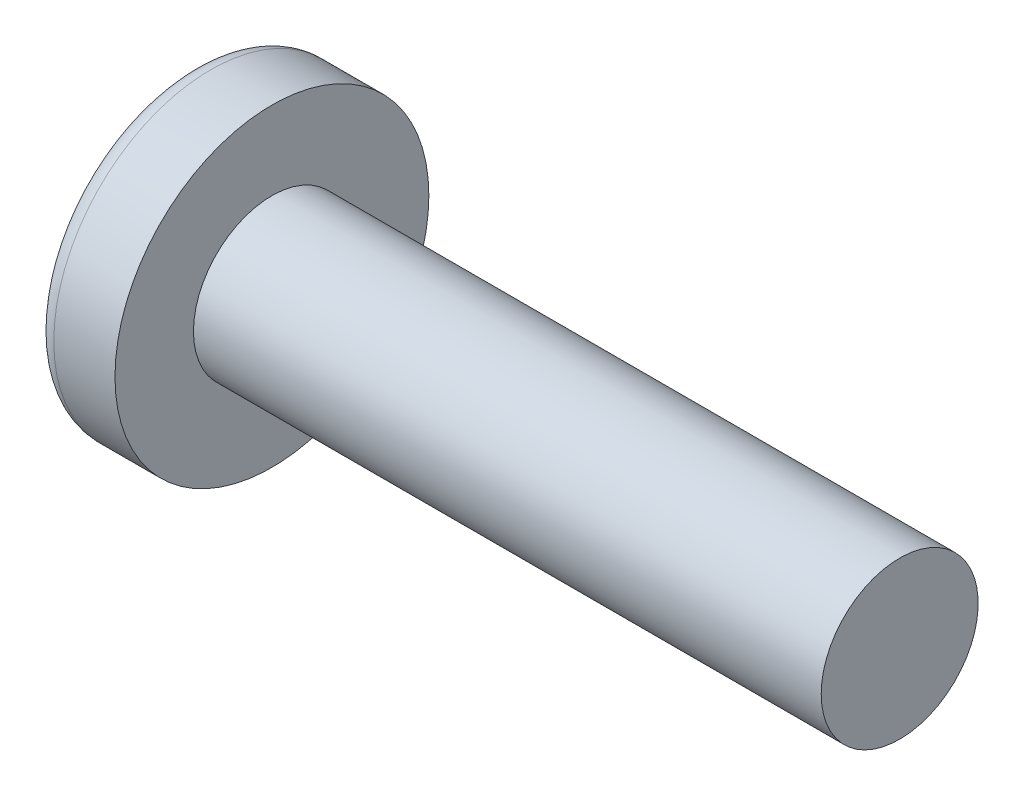
ISO-10303-21;
HEADER;
FILE_DESCRIPTION(('STEP AP214'),'2;1');
FILE_NAME('part.step','',(''),(''),'','','');
FILE_SCHEMA(('AUTOMOTIVE_DESIGN { 1 0 10303 214 1 1 1 1 }'));
ENDSEC;
DATA;
#1=APPLICATION_CONTEXT('core data for automotive mechanical design processes');
#2=APPLICATION_PROTOCOL_DEFINITION('international standard','automotive_design',2000,#1);
#3=PRODUCT_CONTEXT('',#1,'mechanical');
#4=PRODUCT('Part','Part','',(#3));
#5=PRODUCT_RELATED_PRODUCT_CATEGORY('part','',(#4));
#6=PRODUCT_DEFINITION_FORMATION('','',#4);
#7=PRODUCT_DEFINITION_CONTEXT('part definition',#1,'design');
#8=PRODUCT_DEFINITION('design','',#6,#7);
#9=PRODUCT_DEFINITION_SHAPE('','',#8);
#10=(LENGTH_UNIT() NAMED_UNIT(*) SI_UNIT(.MILLI.,.METRE.));
#11=(NAMED_UNIT(*) PLANE_ANGLE_UNIT() SI_UNIT($,.RADIAN.));
#12=(NAMED_UNIT(*) SI_UNIT($,.STERADIAN.) SOLID_ANGLE_UNIT());
#13=UNCERTAINTY_MEASURE_WITH_UNIT(LENGTH_MEASURE(1.E-05),#10,'distance_accuracy_value','');
#14=(GEOMETRIC_REPRESENTATION_CONTEXT(3) GLOBAL_UNCERTAINTY_ASSIGNED_CONTEXT((#13)) GLOBAL_UNIT_ASSIGNED_CONTEXT((#10,
#11,#12)) REPRESENTATION_CONTEXT('',''));
#15=CARTESIAN_POINT('',(0.,0.,0.));
#16=DIRECTION('',(0.,0.,1.));
#17=DIRECTION('',(1.,0.,0.));
#18=AXIS2_PLACEMENT_3D('',#15,#16,#17);
#19=CARTESIAN_POINT('',(0.,0.63,-0.5));
#20=DIRECTION('',(-0.594581022319297,-0.804035700636321,0.));
#21=DIRECTION('',(0.804035700636321,-0.594581022319297,0.));
#22=AXIS2_PLACEMENT_3D('',#19,#20,#21);
#23=PLANE('',#22);
#24=DIRECTION('',(0.,0.,1.));
#25=VECTOR('',#24,1.);
#26=CARTESIAN_POINT('',(0.672608695652169,0.132608695652178,-0.500000000000011));
#27=LINE('',#26,#25);
#28=CARTESIAN_POINT('',(0.672608695652171,0.132608695652177,-0.358695652173914));
#29=VERTEX_POINT('',#28);
#30=CARTESIAN_POINT('',(0.672608695652173,0.132608695652175,-0.132608695652174));
#31=VERTEX_POINT('',#30);
#32=EDGE_CURVE('E297',#29,#31,#27,.T.);
#33=ORIENTED_EDGE('',*,*,#32,.F.);
#34=DIRECTION('',(0.792804972746364,-0.586275946232605,0.166555666543354));
#35=VECTOR('',#34,1.);
#36=CARTESIAN_POINT('',(0.,0.63,-0.5));
#37=LINE('',#36,#35);
#38=CARTESIAN_POINT('',(0.0873856281004798,0.5653786951862,-0.481641674768807));
#39=VERTEX_POINT('',#38);
#40=EDGE_CURVE('E267',#39,#29,#37,.T.);
#41=ORIENTED_EDGE('',*,*,#40,.F.);
#42=CARTESIAN_POINT('',(2.36989545765807,-1.1225277333942,0.));
#43=DIRECTION('',(-0.594581022319297,-0.804035700636321,0.));
#44=DIRECTION('',(0.804035700636321,-0.594581022319297,0.));
#45=AXIS2_PLACEMENT_3D('',#42,#43,#44);
#46=CIRCLE('',#45,2.8793849927622);
#47=CARTESIAN_POINT('',(0.0547751327762322,0.589494019459594,-0.0075720286978301));
#48=VERTEX_POINT('',#47);
#49=EDGE_CURVE('E207',#48,#39,#46,.T.);
#50=ORIENTED_EDGE('',*,*,#49,.F.);
#51=DIRECTION('',(0.790981462786602,-0.584927468279168,0.179466382312927));
#52=VECTOR('',#51,1.);
#53=CARTESIAN_POINT('',(0.,0.63,-0.0200000000000003));
#54=LINE('',#53,#52);
#55=CARTESIAN_POINT('',(0.672608695652174,0.132608695652174,0.132608695652174));
#56=VERTEX_POINT('',#55);
#57=EDGE_CURVE('E176',#48,#56,#54,.T.);
#58=ORIENTED_EDGE('',*,*,#57,.T.);
#59=DIRECTION('',(0.691101660351893,-0.511066774041737,-0.511066774041738));
#60=VECTOR('',#59,1.);
#61=CARTESIAN_POINT('',(0.399114978582753,0.334856150291746,0.334856150291747));
#62=LINE('',#61,#60);
#63=CARTESIAN_POINT('',(0.851931818181818,0.,0.));
#64=VERTEX_POINT('',#63);
#65=EDGE_CURVE('E232',#56,#64,#62,.T.);
#66=ORIENTED_EDGE('',*,*,#65,.T.);
#67=DIRECTION('',(-0.691101660351896,0.511066774041738,-0.511066774041733));
#68=VECTOR('',#67,1.);
#69=CARTESIAN_POINT('',(0.0459158824918185,0.596045397821176,-0.59604539782117));
#70=LINE('',#69,#68);
#71=EDGE_CURVE('E240',#64,#31,#70,.T.);
#72=ORIENTED_EDGE('',*,*,#71,.T.);
#73=EDGE_LOOP('',(#33,#41,#50,#58,#66,#72));
#74=FACE_BOUND('',#73,.T.);
#75=ADVANCED_FACE('F35',(#74),#23,.F.);
#76=CARTESIAN_POINT('',(1.19,0.249999999999999,-0.25));
#77=DIRECTION('',(-0.205595998489482,0.,0.978636952809934));
#78=DIRECTION('',(0.978636952809934,0.,0.205595998489482));
#79=AXIS2_PLACEMENT_3D('',#76,#77,#78);
#80=PLANE('',#79);
#81=ORIENTED_EDGE('',*,*,#40,.T.);
#82=DIRECTION('',(0.955368837936512,0.216764358187274,0.200707739062293));
#83=VECTOR('',#82,1.);
#84=CARTESIAN_POINT('',(1.19,0.250000000000002,-0.25));
#85=LINE('',#84,#83);
#86=CARTESIAN_POINT('',(1.19,0.250000000000003,-0.249999999999997));
#87=VERTEX_POINT('',#86);
#88=EDGE_CURVE('E299',#29,#87,#85,.T.);
#89=ORIENTED_EDGE('',*,*,#88,.T.);
#90=DIRECTION('',(0.473409021532217,-0.875209955773847,0.0994556767924825));
#91=VECTOR('',#90,1.);
#92=CARTESIAN_POINT('',(0.,2.45,-0.5));
#93=LINE('',#92,#91);
#94=CARTESIAN_POINT('',(0.459045311054197,1.60134480309308,-0.403561909442396));
#95=VERTEX_POINT('',#94);
#96=EDGE_CURVE('E195',#95,#87,#93,.T.);
#97=ORIENTED_EDGE('',*,*,#96,.F.);
#98=CARTESIAN_POINT('',(3.16533883403219,0.,0.164987150006763));
#99=DIRECTION('',(-0.205595998489482,0.,0.978636952809934));
#100=DIRECTION('',(0.978636952809934,0.,0.205595998489482));
#101=AXIS2_PLACEMENT_3D('',#98,#99,#100);
#102=CIRCLE('',#101,3.19555595224155);
#103=EDGE_CURVE('E212',#95,#39,#102,.T.);
#104=ORIENTED_EDGE('',*,*,#103,.T.);
#105=EDGE_LOOP('',(#81,#89,#97,#104));
#106=FACE_BOUND('',#105,.T.);
#107=ADVANCED_FACE('F322',(#106),#80,.T.);
#108=CARTESIAN_POINT('',(1.19,0.250000000000002,-0.249999999999998));
#109=DIRECTION('',(0.221266881633904,0.,0.975213293127205));
#110=DIRECTION('',(-0.975213293127205,0.,0.221266881633904));
#111=AXIS2_PLACEMENT_3D('',#108,#109,#110);
#112=PLANE('',#111);
#113=DIRECTION('',(0.473019901759846,0.874490574682069,-0.10732384325643));
#114=VECTOR('',#113,1.);
#115=CARTESIAN_POINT('',(0.,-2.45,0.0199999999999829));
#116=LINE('',#115,#114);
#117=CARTESIAN_POINT('',(0.445410972162868,-1.62655114390058,-0.0810596323394858));
#118=VERTEX_POINT('',#117);
#119=CARTESIAN_POINT('',(1.19,-0.249999999999997,-0.250000000000002));
#120=VERTEX_POINT('',#119);
#121=EDGE_CURVE('E158',#118,#120,#116,.T.);
#122=ORIENTED_EDGE('',*,*,#121,.T.);
#123=DIRECTION('',(-0.955368837936512,-0.200707739062295,0.216764358187275));
#124=VECTOR('',#123,1.);
#125=CARTESIAN_POINT('',(1.2858749597164,-0.229858201740249,-0.27175314212053));
#126=LINE('',#125,#124);
#127=CARTESIAN_POINT('',(0.672608695652176,-0.358695652173911,-0.132608695652177));
#128=VERTEX_POINT('',#127);
#129=EDGE_CURVE('E11',#120,#128,#126,.T.);
#130=ORIENTED_EDGE('',*,*,#129,.T.);
#131=DIRECTION('',(0.,-1.,0.));
#132=VECTOR('',#131,1.);
#133=CARTESIAN_POINT('',(0.672608695652173,0.249999999999999,-0.132608695652172));
#134=LINE('',#133,#132);
#135=CARTESIAN_POINT('',(0.672608695652175,-0.132608695652172,-0.132608695652175));
#136=VERTEX_POINT('',#135);
#137=EDGE_CURVE('E154',#136,#128,#134,.T.);
#138=ORIENTED_EDGE('',*,*,#137,.F.);
#139=DIRECTION('',(0.790981462786602,0.58492746827917,-0.179466382312923));
#140=VECTOR('',#139,1.);
#141=CARTESIAN_POINT('',(0.,-0.63,0.0199999999999959));
#142=LINE('',#141,#140);
#143=CARTESIAN_POINT('',(0.0547751327762314,-0.589494019459594,0.00757202869782609));
#144=VERTEX_POINT('',#143);
#145=EDGE_CURVE('E227',#144,#136,#142,.T.);
#146=ORIENTED_EDGE('',*,*,#145,.F.);
#147=CARTESIAN_POINT('',(3.04764674278039,0.,-0.671482874412358));
#148=DIRECTION('',(0.221266881633904,0.,0.975213293127205));
#149=DIRECTION('',(0.975213293127205,0.,-0.221266881633904));
#150=AXIS2_PLACEMENT_3D('',#147,#148,#149);
#151=CIRCLE('',#150,3.12504387719365);
#152=EDGE_CURVE('E163',#144,#118,#151,.T.);
#153=ORIENTED_EDGE('',*,*,#152,.T.);
#154=EDGE_LOOP('',(#122,#130,#138,#146,#153));
#155=FACE_BOUND('',#154,.T.);
#156=ADVANCED_FACE('F160',(#155),#112,.T.);
#157=CARTESIAN_POINT('',(1.19,-0.249999999999999,-0.250000000000001));
#158=DIRECTION('',(0.221266881633904,0.975213293127205,0.));
#159=DIRECTION('',(-0.975213293127205,0.221266881633904,0.));
#160=AXIS2_PLACEMENT_3D('',#157,#158,#159);
#161=PLANE('',#160);
#162=DIRECTION('',(0.473019901759846,-0.107323843256433,-0.874490574682068));
#163=VECTOR('',#162,1.);
#164=CARTESIAN_POINT('',(0.,0.0199999999999915,2.45));
#165=LINE('',#164,#163);
#166=CARTESIAN_POINT('',(0.445410972162869,-0.0810596323394804,1.62655114390058));
#167=VERTEX_POINT('',#166);
#168=CARTESIAN_POINT('',(1.19,-0.250000000000002,0.249999999999998));
#169=VERTEX_POINT('',#168);
#170=EDGE_CURVE('E248',#167,#169,#165,.T.);
#171=ORIENTED_EDGE('',*,*,#170,.T.);
#172=DIRECTION('',(-0.955368837936512,0.216764358187275,0.200707739062294));
#173=VECTOR('',#172,1.);
#174=CARTESIAN_POINT('',(1.2858749597164,-0.271753142120529,0.229858201740249));
#175=LINE('',#174,#173);
#176=CARTESIAN_POINT('',(0.672608695652176,-0.132608695652175,0.358695652173912));
#177=VERTEX_POINT('',#176);
#178=EDGE_CURVE('E221',#169,#177,#175,.T.);
#179=ORIENTED_EDGE('',*,*,#178,.T.);
#180=DIRECTION('',(0.,0.,1.));
#181=VECTOR('',#180,1.);
#182=CARTESIAN_POINT('',(0.672608695652173,-0.132608695652173,-0.249999999999999));
#183=LINE('',#182,#181);
#184=CARTESIAN_POINT('',(0.672608695652175,-0.132608695652174,0.132608695652173));
#185=VERTEX_POINT('',#184);
#186=EDGE_CURVE('E290',#185,#177,#183,.T.);
#187=ORIENTED_EDGE('',*,*,#186,.F.);
#188=DIRECTION('',(0.790981462786602,-0.179466382312925,-0.584927468279169));
#189=VECTOR('',#188,1.);
#190=CARTESIAN_POINT('',(0.,0.0199999999999981,0.63));
#191=LINE('',#190,#189);
#192=CARTESIAN_POINT('',(0.0547751327762322,0.00757202869782815,0.589494019459594));
#193=VERTEX_POINT('',#192);
#194=EDGE_CURVE('E235',#193,#185,#191,.T.);
#195=ORIENTED_EDGE('',*,*,#194,.F.);
#196=CARTESIAN_POINT('',(3.04764674278039,-0.671482874412358,0.));
#197=DIRECTION('',(0.221266881633904,0.975213293127205,0.));
#198=DIRECTION('',(-0.975213293127205,0.221266881633904,0.));
#199=AXIS2_PLACEMENT_3D('',#196,#197,#198);
#200=CIRCLE('',#199,3.12504387719365);
#201=EDGE_CURVE('E255',#193,#167,#200,.T.);
#202=ORIENTED_EDGE('',*,*,#201,.T.);
#203=EDGE_LOOP('',(#171,#179,#187,#195,#202));
#204=FACE_BOUND('',#203,.T.);
#205=ADVANCED_FACE('F276',(#204),#161,.T.);
#206=CARTESIAN_POINT('',(1.19,-0.25,0.25));
#207=DIRECTION('',(0.221266881633904,0.,-0.975213293127205));
#208=DIRECTION('',(-0.975213293127205,0.,-0.221266881633904));
#209=AXIS2_PLACEMENT_3D('',#206,#207,#208);
#210=PLANE('',#209);
#211=DIRECTION('',(0.473019901759846,-0.874490574682068,0.107323843256436));
#212=VECTOR('',#211,1.);
#213=CARTESIAN_POINT('',(0.,2.45,-0.0200000000000001));
#214=LINE('',#213,#212);
#215=CARTESIAN_POINT('',(0.445410972162869,1.62655114390058,0.0810596323394745));
#216=VERTEX_POINT('',#215);
#217=CARTESIAN_POINT('',(1.19,0.249999999999999,0.250000000000001));
#218=VERTEX_POINT('',#217);
#219=EDGE_CURVE('E264',#216,#218,#214,.T.);
#220=ORIENTED_EDGE('',*,*,#219,.T.);
#221=DIRECTION('',(-0.955368837936512,0.200707739062293,-0.216764358187276));
#222=VECTOR('',#221,1.);
#223=CARTESIAN_POINT('',(1.2858749597164,0.22985820174025,0.271753142120529));
#224=LINE('',#223,#222);
#225=CARTESIAN_POINT('',(0.672608695652176,0.358695652173912,0.132608695652174));
#226=VERTEX_POINT('',#225);
#227=EDGE_CURVE('E257',#218,#226,#224,.T.);
#228=ORIENTED_EDGE('',*,*,#227,.T.);
#229=DIRECTION('',(0.,1.,0.));
#230=VECTOR('',#229,1.);
#231=CARTESIAN_POINT('',(0.672608695652173,-0.249999999999998,0.132608695652174));
#232=LINE('',#231,#230);
#233=EDGE_CURVE('E242',#56,#226,#232,.T.);
#234=ORIENTED_EDGE('',*,*,#233,.F.);
#235=ORIENTED_EDGE('',*,*,#57,.F.);
#236=CARTESIAN_POINT('',(3.04764674278039,0.,0.671482874412358));
#237=DIRECTION('',(0.221266881633904,0.,-0.975213293127205));
#238=DIRECTION('',(-0.975213293127205,0.,-0.221266881633904));
#239=AXIS2_PLACEMENT_3D('',#236,#237,#238);
#240=CIRCLE('',#239,3.12504387719365);
#241=EDGE_CURVE('E210',#48,#216,#240,.T.);
#242=ORIENTED_EDGE('',*,*,#241,.T.);
#243=EDGE_LOOP('',(#220,#228,#234,#235,#242));
#244=FACE_BOUND('',#243,.T.);
#245=ADVANCED_FACE('F329',(#244),#210,.T.);
#246=CARTESIAN_POINT('',(-25.4,0.,0.));
#247=DIRECTION('',(-1.,0.,0.));
#248=DIRECTION('',(0.,0.,1.));
#249=AXIS2_PLACEMENT_3D('',#246,#247,#248);
#250=CYLINDRICAL_SURFACE('',#249,1.);
#251=CARTESIAN_POINT('',(9.6,0.,0.));
#252=DIRECTION('',(-1.,0.,0.));
#253=DIRECTION('',(0.,0.,1.));
#254=AXIS2_PLACEMENT_3D('',#251,#252,#253);
#255=CIRCLE('',#254,1.);
#256=CARTESIAN_POINT('',(9.6,0.,1.));
#257=VERTEX_POINT('',#256);
#258=EDGE_CURVE('E191',#257,#257,#255,.T.);
#259=ORIENTED_EDGE('',*,*,#258,.T.);
#260=EDGE_LOOP('',(#259));
#261=FACE_BOUND('',#260,.T.);
#262=CARTESIAN_POINT('',(1.6,0.,0.));
#263=DIRECTION('',(-1.,0.,0.));
#264=DIRECTION('',(0.,0.,1.));
#265=AXIS2_PLACEMENT_3D('',#262,#263,#264);
#266=CIRCLE('',#265,1.);
#267=CARTESIAN_POINT('',(1.6,0.,1.));
#268=VERTEX_POINT('',#267);
#269=EDGE_CURVE('E204',#268,#268,#266,.T.);
#270=ORIENTED_EDGE('',*,*,#269,.F.);
#271=EDGE_LOOP('',(#270));
#272=FACE_BOUND('',#271,.T.);
#273=ADVANCED_FACE('F37',(#261,#272),#250,.T.);
#274=CARTESIAN_POINT('',(1.6,1.,0.));
#275=DIRECTION('',(-1.,0.,0.));
#276=DIRECTION('',(0.,0.,1.));
#277=AXIS2_PLACEMENT_3D('',#274,#275,#276);
#278=PLANE('',#277);
#279=CARTESIAN_POINT('',(1.6,0.,0.));
#280=DIRECTION('',(-1.,0.,0.));
#281=DIRECTION('',(0.,0.,1.));
#282=AXIS2_PLACEMENT_3D('',#279,#280,#281);
#283=CIRCLE('',#282,2.);
#284=CARTESIAN_POINT('',(1.6,0.,2.));
#285=VERTEX_POINT('',#284);
#286=EDGE_CURVE('E201',#285,#285,#283,.T.);
#287=ORIENTED_EDGE('',*,*,#286,.F.);
#288=EDGE_LOOP('',(#287));
#289=FACE_BOUND('',#288,.T.);
#290=ORIENTED_EDGE('',*,*,#269,.T.);
#291=EDGE_LOOP('',(#290));
#292=FACE_BOUND('',#291,.T.);
#293=ADVANCED_FACE('F499',(#289,#292),#278,.F.);
#294=CARTESIAN_POINT('',(-25.4,0.,0.));
#295=DIRECTION('',(-1.,0.,0.));
#296=DIRECTION('',(0.,0.,1.));
#297=AXIS2_PLACEMENT_3D('',#294,#295,#296);
#298=CYLINDRICAL_SURFACE('',#297,2.);
#299=ORIENTED_EDGE('',*,*,#286,.T.);
#300=EDGE_LOOP('',(#299));
#301=FACE_BOUND('',#300,.T.);
#302=CARTESIAN_POINT('',(0.820084035097039,0.,0.));
#303=DIRECTION('',(-1.,0.,0.));
#304=DIRECTION('',(0.,0.,1.));
#305=AXIS2_PLACEMENT_3D('',#302,#303,#304);
#306=CIRCLE('',#305,2.);
#307=CARTESIAN_POINT('',(0.820084035097039,0.,2.));
#308=VERTEX_POINT('',#307);
#309=EDGE_CURVE('E198',#308,#308,#306,.T.);
#310=ORIENTED_EDGE('',*,*,#309,.F.);
#311=EDGE_LOOP('',(#310));
#312=FACE_BOUND('',#311,.T.);
#313=ADVANCED_FACE('F349',(#301,#312),#298,.T.);
#314=CARTESIAN_POINT('',(0.820084035097039,0.,0.));
#315=DIRECTION('',(-1.,0.,0.));
#316=DIRECTION('',(0.,0.,1.));
#317=AXIS2_PLACEMENT_3D('',#314,#315,#316);
#318=TOROIDAL_SURFACE('',#317,1.76,0.24);
#319=ORIENTED_EDGE('',*,*,#309,.T.);
#320=EDGE_LOOP('',(#319));
#321=FACE_BOUND('',#320,.T.);
#322=CARTESIAN_POINT('',(0.627117875780583,0.,0.));
#323=DIRECTION('',(-1.,0.,0.));
#324=DIRECTION('',(0.,0.,1.));
#325=AXIS2_PLACEMENT_3D('',#322,#323,#324);
#326=CIRCLE('',#325,1.9027027027027);
#327=CARTESIAN_POINT('',(0.627117875780583,0.,1.9027027027027));
#328=VERTEX_POINT('',#327);
#329=EDGE_CURVE('E194',#328,#328,#326,.T.);
#330=ORIENTED_EDGE('',*,*,#329,.F.);
#331=EDGE_LOOP('',(#330));
#332=FACE_BOUND('',#331,.T.);
#333=ADVANCED_FACE('F340',(#321,#332),#318,.T.);
#334=CARTESIAN_POINT('',(3.2,0.,0.));
#335=DIRECTION('',(-1.,0.,0.));
#336=DIRECTION('',(0.,1.,0.));
#337=AXIS2_PLACEMENT_3D('',#334,#335,#336);
#338=SPHERICAL_SURFACE('',#337,3.2);
#339=CARTESIAN_POINT('',(3.16533883403219,0.164987150006763,0.));
#340=DIRECTION('',(-0.205595998489482,0.978636952809934,0.));
#341=DIRECTION('',(-0.978636952809934,-0.205595998489482,0.));
#342=AXIS2_PLACEMENT_3D('',#339,#340,#341);
#343=CIRCLE('',#342,3.19555595224155);
#344=CARTESIAN_POINT('',(0.459045311054196,-0.403561909442379,-1.60134480309309));
#345=VERTEX_POINT('',#344);
#346=CARTESIAN_POINT('',(0.0873856281004798,-0.481641674768801,-0.565378695186206));
#347=VERTEX_POINT('',#346);
#348=EDGE_CURVE('E302',#345,#347,#343,.T.);
#349=ORIENTED_EDGE('',*,*,#348,.F.);
#350=CARTESIAN_POINT('',(1.74959159859977,0.,0.784539089848308));
#351=DIRECTION('',(0.879570874094627,0.,-0.475767881896639));
#352=DIRECTION('',(-0.475767881896639,0.,-0.879570874094627));
#353=AXIS2_PLACEMENT_3D('',#350,#351,#352);
#354=CIRCLE('',#353,2.74241023292424);
#355=CARTESIAN_POINT('',(0.445410972162869,0.0810596323394916,-1.62655114390058));
#356=VERTEX_POINT('',#355);
#357=EDGE_CURVE('E153',#345,#356,#354,.T.);
#358=ORIENTED_EDGE('',*,*,#357,.T.);
#359=CARTESIAN_POINT('',(3.04764674278039,0.671482874412358,0.));
#360=DIRECTION('',(0.221266881633904,-0.975213293127205,0.));
#361=DIRECTION('',(0.975213293127205,0.221266881633904,0.));
#362=AXIS2_PLACEMENT_3D('',#359,#360,#361);
#363=CIRCLE('',#362,3.12504387719364);
#364=CARTESIAN_POINT('',(0.0547751327762322,-0.00757202869782392,-0.589494019459594));
#365=VERTEX_POINT('',#364);
#366=EDGE_CURVE('E293',#365,#356,#363,.T.);
#367=ORIENTED_EDGE('',*,*,#366,.F.);
#368=CARTESIAN_POINT('',(2.36989545765807,0.,1.1225277333942));
#369=DIRECTION('',(-0.594581022319297,0.,0.804035700636321));
#370=DIRECTION('',(0.804035700636321,0.,0.594581022319297));
#371=AXIS2_PLACEMENT_3D('',#368,#369,#370);
#372=CIRCLE('',#371,2.8793849927622);
#373=EDGE_CURVE('E304',#365,#347,#372,.T.);
#374=ORIENTED_EDGE('',*,*,#373,.T.);
#375=EDGE_LOOP('',(#349,#358,#367,#374));
#376=FACE_BOUND('',#375,.T.);
#377=CARTESIAN_POINT('',(3.16533883403219,0.,-0.164987150006763));
#378=DIRECTION('',(-0.205595998489482,0.,-0.978636952809934));
#379=DIRECTION('',(-0.978636952809934,0.,0.205595998489482));
#380=AXIS2_PLACEMENT_3D('',#377,#378,#379);
#381=CIRCLE('',#380,3.19555595224155);
#382=CARTESIAN_POINT('',(0.459045311054196,-1.60134480309309,0.403561909442385));
#383=VERTEX_POINT('',#382);
#384=CARTESIAN_POINT('',(0.0873856281004789,-0.565378695186204,0.481641674768803));
#385=VERTEX_POINT('',#384);
#386=EDGE_CURVE('E284',#383,#385,#381,.T.);
#387=ORIENTED_EDGE('',*,*,#386,.F.);
#388=CARTESIAN_POINT('',(1.74959159859977,0.784539089848306,0.));
#389=DIRECTION('',(0.879570874094627,-0.475767881896639,0.));
#390=DIRECTION('',(0.475767881896639,0.879570874094627,0.));
#391=AXIS2_PLACEMENT_3D('',#388,#389,#390);
#392=CIRCLE('',#391,2.74241023292424);
#393=EDGE_CURVE('E282',#383,#118,#392,.T.);
#394=ORIENTED_EDGE('',*,*,#393,.T.);
#395=ORIENTED_EDGE('',*,*,#152,.F.);
#396=CARTESIAN_POINT('',(2.36989545765807,1.1225277333942,0.));
#397=DIRECTION('',(-0.594581022319297,0.804035700636321,0.));
#398=DIRECTION('',(-0.804035700636321,-0.594581022319297,0.));
#399=AXIS2_PLACEMENT_3D('',#396,#397,#398);
#400=CIRCLE('',#399,2.8793849927622);
#401=EDGE_CURVE('E287',#144,#385,#400,.T.);
#402=ORIENTED_EDGE('',*,*,#401,.T.);
#403=EDGE_LOOP('',(#387,#394,#395,#402));
#404=FACE_BOUND('',#403,.T.);
#405=CARTESIAN_POINT('',(3.16533883403219,-0.164987150006763,0.));
#406=DIRECTION('',(-0.205595998489482,-0.978636952809934,0.));
#407=DIRECTION('',(0.978636952809934,-0.205595998489482,0.));
#408=AXIS2_PLACEMENT_3D('',#405,#406,#407);
#409=CIRCLE('',#408,3.19555595224155);
#410=CARTESIAN_POINT('',(0.459045311054196,0.40356190944239,1.60134480309308));
#411=VERTEX_POINT('',#410);
#412=CARTESIAN_POINT('',(0.0873856281004802,0.481641674768805,0.565378695186202));
#413=VERTEX_POINT('',#412);
#414=EDGE_CURVE('E187',#411,#413,#409,.T.);
#415=ORIENTED_EDGE('',*,*,#414,.F.);
#416=CARTESIAN_POINT('',(1.74959159859977,0.,-0.784539089848308));
#417=DIRECTION('',(0.879570874094627,0.,0.475767881896639));
#418=DIRECTION('',(0.475767881896639,0.,-0.879570874094627));
#419=AXIS2_PLACEMENT_3D('',#416,#417,#418);
#420=CIRCLE('',#419,2.74241023292424);
#421=EDGE_CURVE('E183',#411,#167,#420,.T.);
#422=ORIENTED_EDGE('',*,*,#421,.T.);
#423=ORIENTED_EDGE('',*,*,#201,.F.);
#424=CARTESIAN_POINT('',(2.36989545765807,0.,-1.1225277333942));
#425=DIRECTION('',(-0.594581022319297,0.,-0.804035700636321));
#426=DIRECTION('',(-0.804035700636321,0.,0.594581022319297));
#427=AXIS2_PLACEMENT_3D('',#424,#425,#426);
#428=CIRCLE('',#427,2.8793849927622);
#429=EDGE_CURVE('E245',#193,#413,#428,.T.);
#430=ORIENTED_EDGE('',*,*,#429,.T.);
#431=EDGE_LOOP('',(#415,#422,#423,#430));
#432=FACE_BOUND('',#431,.T.);
#433=ORIENTED_EDGE('',*,*,#103,.F.);
#434=CARTESIAN_POINT('',(1.74959159859977,-0.784539089848309,0.));
#435=DIRECTION('',(0.879570874094627,0.475767881896639,0.));
#436=DIRECTION('',(-0.475767881896639,0.879570874094627,0.));
#437=AXIS2_PLACEMENT_3D('',#434,#435,#436);
#438=CIRCLE('',#437,2.74241023292424);
#439=EDGE_CURVE('E215',#95,#216,#438,.T.);
#440=ORIENTED_EDGE('',*,*,#439,.T.);
#441=ORIENTED_EDGE('',*,*,#241,.F.);
#442=ORIENTED_EDGE('',*,*,#49,.T.);
#443=EDGE_LOOP('',(#433,#440,#441,#442));
#444=FACE_BOUND('',#443,.T.);
#445=ORIENTED_EDGE('',*,*,#329,.T.);
#446=EDGE_LOOP('',(#445));
#447=FACE_BOUND('',#446,.T.);
#448=ADVANCED_FACE('F318',(#376,#404,#432,#444,#447),#338,.T.);
#449=CARTESIAN_POINT('',(9.6,1.,0.));
#450=DIRECTION('',(1.,0.,0.));
#451=DIRECTION('',(0.,0.,-1.));
#452=AXIS2_PLACEMENT_3D('',#449,#450,#451);
#453=PLANE('',#452);
#454=ORIENTED_EDGE('',*,*,#258,.F.);
#455=EDGE_LOOP('',(#454));
#456=FACE_BOUND('',#455,.T.);
#457=ADVANCED_FACE('F339',(#456),#453,.T.);
#458=CARTESIAN_POINT('',(1.19,0.25,0.25));
#459=DIRECTION('',(0.879570874094627,0.475767881896639,0.));
#460=DIRECTION('',(-0.475767881896639,0.879570874094627,0.));
#461=AXIS2_PLACEMENT_3D('',#458,#459,#460);
#462=PLANE('',#461);
#463=ORIENTED_EDGE('',*,*,#96,.T.);
#464=DIRECTION('',(0.,0.,-1.));
#465=VECTOR('',#464,1.);
#466=CARTESIAN_POINT('',(1.19,0.25,0.25));
#467=LINE('',#466,#465);
#468=EDGE_CURVE('E182',#218,#87,#467,.T.);
#469=ORIENTED_EDGE('',*,*,#468,.F.);
#470=ORIENTED_EDGE('',*,*,#219,.F.);
#471=ORIENTED_EDGE('',*,*,#439,.F.);
#472=EDGE_LOOP('',(#463,#469,#470,#471));
#473=FACE_BOUND('',#472,.T.);
#474=ADVANCED_FACE('F346',(#473),#462,.F.);
#475=CARTESIAN_POINT('',(1.19,0.25,-0.25));
#476=DIRECTION('',(-1.,0.,0.));
#477=DIRECTION('',(0.,0.,1.));
#478=AXIS2_PLACEMENT_3D('',#475,#476,#477);
#479=PLANE('',#478);
#480=DIRECTION('',(0.,1.,0.));
#481=VECTOR('',#480,1.);
#482=CARTESIAN_POINT('',(1.19,-0.25,-0.25));
#483=LINE('',#482,#481);
#484=EDGE_CURVE('E150',#120,#87,#483,.T.);
#485=ORIENTED_EDGE('',*,*,#484,.F.);
#486=DIRECTION('',(0.,0.,1.));
#487=VECTOR('',#486,1.);
#488=CARTESIAN_POINT('',(1.19,-0.25,-0.25));
#489=LINE('',#488,#487);
#490=EDGE_CURVE('E170',#120,#169,#489,.T.);
#491=ORIENTED_EDGE('',*,*,#490,.T.);
#492=DIRECTION('',(0.,-1.,0.));
#493=VECTOR('',#492,1.);
#494=CARTESIAN_POINT('',(1.19,0.25,0.25));
#495=LINE('',#494,#493);
#496=EDGE_CURVE('E177',#218,#169,#495,.T.);
#497=ORIENTED_EDGE('',*,*,#496,.F.);
#498=ORIENTED_EDGE('',*,*,#468,.T.);
#499=EDGE_LOOP('',(#485,#491,#497,#498));
#500=FACE_BOUND('',#499,.T.);
#501=ADVANCED_FACE('F180',(#500),#479,.T.);
#502=CARTESIAN_POINT('',(1.19,-0.250000000000001,0.249999999999999));
#503=DIRECTION('',(0.879570874094627,0.,0.475767881896639));
#504=DIRECTION('',(-0.475767881896639,0.,0.879570874094627));
#505=AXIS2_PLACEMENT_3D('',#502,#503,#504);
#506=PLANE('',#505);
#507=DIRECTION('',(0.473409021532217,-0.0994556767924795,-0.875209955773847));
#508=VECTOR('',#507,1.);
#509=CARTESIAN_POINT('',(0.,0.499999999999991,2.45));
#510=LINE('',#509,#508);
#511=EDGE_CURVE('E243',#411,#218,#510,.T.);
#512=ORIENTED_EDGE('',*,*,#511,.T.);
#513=ORIENTED_EDGE('',*,*,#496,.T.);
#514=ORIENTED_EDGE('',*,*,#170,.F.);
#515=ORIENTED_EDGE('',*,*,#421,.F.);
#516=EDGE_LOOP('',(#512,#513,#514,#515));
#517=FACE_BOUND('',#516,.T.);
#518=ADVANCED_FACE('F273',(#517),#506,.F.);
#519=CARTESIAN_POINT('',(1.19,0.249999999999999,0.25));
#520=DIRECTION('',(-0.205595998489482,-0.978636952809934,0.));
#521=DIRECTION('',(0.978636952809934,-0.205595998489482,0.));
#522=AXIS2_PLACEMENT_3D('',#519,#520,#521);
#523=PLANE('',#522);
#524=ORIENTED_EDGE('',*,*,#414,.T.);
#525=DIRECTION('',(0.792804972746364,-0.166555666543352,-0.586275946232606));
#526=VECTOR('',#525,1.);
#527=CARTESIAN_POINT('',(0.,0.499999999999998,0.630000000000002));
#528=LINE('',#527,#526);
#529=EDGE_CURVE('E278',#413,#226,#528,.T.);
#530=ORIENTED_EDGE('',*,*,#529,.T.);
#531=ORIENTED_EDGE('',*,*,#227,.F.);
#532=ORIENTED_EDGE('',*,*,#511,.F.);
#533=EDGE_LOOP('',(#524,#530,#531,#532));
#534=FACE_BOUND('',#533,.T.);
#535=ADVANCED_FACE('F332',(#534),#523,.T.);
#536=CARTESIAN_POINT('',(0.,0.499999999999998,0.630000000000002));
#537=DIRECTION('',(-0.594581022319297,0.,-0.804035700636321));
#538=DIRECTION('',(0.804035700636321,0.,-0.594581022319297));
#539=AXIS2_PLACEMENT_3D('',#536,#537,#538);
#540=PLANE('',#539);
#541=ORIENTED_EDGE('',*,*,#194,.T.);
#542=DIRECTION('',(0.691101660351893,0.51106677404174,-0.511066774041735));
#543=VECTOR('',#542,1.);
#544=CARTESIAN_POINT('',(0.399114978582753,-0.334856150291748,0.334856150291745));
#545=LINE('',#544,#543);
#546=EDGE_CURVE('E218',#185,#64,#545,.T.);
#547=ORIENTED_EDGE('',*,*,#546,.T.);
#548=ORIENTED_EDGE('',*,*,#65,.F.);
#549=ORIENTED_EDGE('',*,*,#233,.T.);
#550=ORIENTED_EDGE('',*,*,#529,.F.);
#551=ORIENTED_EDGE('',*,*,#429,.F.);
#552=EDGE_LOOP('',(#541,#547,#548,#549,#550,#551));
#553=FACE_BOUND('',#552,.T.);
#554=ADVANCED_FACE('F231',(#553),#540,.F.);
#555=CARTESIAN_POINT('',(1.19,-0.249999999999998,-0.250000000000002));
#556=DIRECTION('',(0.879570874094627,-0.475767881896639,0.));
#557=DIRECTION('',(-0.475767881896639,-0.879570874094627,0.));
#558=AXIS2_PLACEMENT_3D('',#555,#556,#557);
#559=PLANE('',#558);
#560=DIRECTION('',(0.473409021532217,0.875209955773847,-0.0994556767924764));
#561=VECTOR('',#560,1.);
#562=CARTESIAN_POINT('',(0.,-2.45,0.499999999999983));
#563=LINE('',#562,#561);
#564=EDGE_CURVE('E166',#383,#169,#563,.T.);
#565=ORIENTED_EDGE('',*,*,#564,.T.);
#566=ORIENTED_EDGE('',*,*,#490,.F.);
#567=ORIENTED_EDGE('',*,*,#121,.F.);
#568=ORIENTED_EDGE('',*,*,#393,.F.);
#569=EDGE_LOOP('',(#565,#566,#567,#568));
#570=FACE_BOUND('',#569,.T.);
#571=ADVANCED_FACE('F171',(#570),#559,.F.);
#572=CARTESIAN_POINT('',(1.19,-0.250000000000001,0.249999999999998));
#573=DIRECTION('',(-0.205595998489482,0.,-0.978636952809934));
#574=DIRECTION('',(0.978636952809934,0.,-0.205595998489482));
#575=AXIS2_PLACEMENT_3D('',#572,#573,#574);
#576=PLANE('',#575);
#577=ORIENTED_EDGE('',*,*,#386,.T.);
#578=DIRECTION('',(0.792804972746364,0.586275946232606,-0.16655566654335));
#579=VECTOR('',#578,1.);
#580=CARTESIAN_POINT('',(0.,-0.630000000000004,0.499999999999996));
#581=LINE('',#580,#579);
#582=EDGE_CURVE('E58',#385,#177,#581,.T.);
#583=ORIENTED_EDGE('',*,*,#582,.T.);
#584=ORIENTED_EDGE('',*,*,#178,.F.);
#585=ORIENTED_EDGE('',*,*,#564,.F.);
#586=EDGE_LOOP('',(#577,#583,#584,#585));
#587=FACE_BOUND('',#586,.T.);
#588=ADVANCED_FACE('F336',(#587),#576,.T.);
#589=CARTESIAN_POINT('',(0.,-0.630000000000004,0.499999999999996));
#590=DIRECTION('',(-0.594581022319297,0.804035700636321,0.));
#591=DIRECTION('',(0.804035700636321,0.594581022319297,0.));
#592=AXIS2_PLACEMENT_3D('',#589,#590,#591);
#593=PLANE('',#592);
#594=ORIENTED_EDGE('',*,*,#145,.T.);
#595=DIRECTION('',(0.691101660351893,0.511066774041733,0.511066774041742));
#596=VECTOR('',#595,1.);
#597=CARTESIAN_POINT('',(0.399114978582753,-0.334856150291743,-0.334856150291749));
#598=LINE('',#597,#596);
#599=EDGE_CURVE('E43',#136,#64,#598,.T.);
#600=ORIENTED_EDGE('',*,*,#599,.T.);
#601=ORIENTED_EDGE('',*,*,#546,.F.);
#602=ORIENTED_EDGE('',*,*,#186,.T.);
#603=ORIENTED_EDGE('',*,*,#582,.F.);
#604=ORIENTED_EDGE('',*,*,#401,.F.);
#605=EDGE_LOOP('',(#594,#600,#601,#602,#603,#604));
#606=FACE_BOUND('',#605,.T.);
#607=ADVANCED_FACE('F225',(#606),#593,.F.);
#608=CARTESIAN_POINT('',(1.19,0.249999999999997,0.250000000000003));
#609=DIRECTION('',(0.221266881633904,-0.975213293127205,0.));
#610=DIRECTION('',(-0.975213293127205,-0.221266881633904,0.));
#611=AXIS2_PLACEMENT_3D('',#608,#609,#610);
#612=PLANE('',#611);
#613=ORIENTED_EDGE('',*,*,#366,.T.);
#614=DIRECTION('',(0.473019901759846,0.107323843256426,0.874490574682069));
#615=VECTOR('',#614,1.);
#616=CARTESIAN_POINT('',(0.,-0.0199999999999744,-2.45));
#617=LINE('',#616,#615);
#618=EDGE_CURVE('E155',#356,#87,#617,.T.);
#619=ORIENTED_EDGE('',*,*,#618,.T.);
#620=ORIENTED_EDGE('',*,*,#88,.F.);
#621=ORIENTED_EDGE('',*,*,#32,.T.);
#622=DIRECTION('',(0.790981462786602,0.179466382312921,0.58492746827917));
#623=VECTOR('',#622,1.);
#624=CARTESIAN_POINT('',(0.,-0.0199999999999937,-0.630000000000001));
#625=LINE('',#624,#623);
#626=EDGE_CURVE('E309',#365,#31,#625,.T.);
#627=ORIENTED_EDGE('',*,*,#626,.F.);
#628=EDGE_LOOP('',(#613,#619,#620,#621,#627));
#629=FACE_BOUND('',#628,.T.);
#630=ADVANCED_FACE('F314',(#629),#612,.T.);
#631=CARTESIAN_POINT('',(1.19,0.250000000000003,-0.249999999999997));
#632=DIRECTION('',(0.879570874094627,0.,-0.475767881896639));
#633=DIRECTION('',(-0.475767881896639,0.,-0.879570874094627));
#634=AXIS2_PLACEMENT_3D('',#631,#632,#633);
#635=PLANE('',#634);
#636=DIRECTION('',(0.473409021532217,0.0994556767924734,0.875209955773848));
#637=VECTOR('',#636,1.);
#638=CARTESIAN_POINT('',(0.,-0.499999999999974,-2.45000000000001));
#639=LINE('',#638,#637);
#640=EDGE_CURVE('E140',#345,#120,#639,.T.);
#641=ORIENTED_EDGE('',*,*,#640,.T.);
#642=ORIENTED_EDGE('',*,*,#484,.T.);
#643=ORIENTED_EDGE('',*,*,#618,.F.);
#644=ORIENTED_EDGE('',*,*,#357,.F.);
#645=EDGE_LOOP('',(#641,#642,#643,#644));
#646=FACE_BOUND('',#645,.T.);
#647=ADVANCED_FACE('F147',(#646),#635,.F.);
#648=CARTESIAN_POINT('',(1.19,-0.249999999999997,-0.250000000000002));
#649=DIRECTION('',(-0.205595998489482,0.978636952809934,0.));
#650=DIRECTION('',(0.978636952809934,0.205595998489482,0.));
#651=AXIS2_PLACEMENT_3D('',#648,#649,#650);
#652=PLANE('',#651);
#653=ORIENTED_EDGE('',*,*,#348,.T.);
#654=DIRECTION('',(0.792804972746364,0.166555666543348,0.586275946232607));
#655=VECTOR('',#654,1.);
#656=CARTESIAN_POINT('',(0.,-0.499999999999993,-0.630000000000006));
#657=LINE('',#656,#655);
#658=EDGE_CURVE('E50',#347,#128,#657,.T.);
#659=ORIENTED_EDGE('',*,*,#658,.T.);
#660=ORIENTED_EDGE('',*,*,#129,.F.);
#661=ORIENTED_EDGE('',*,*,#640,.F.);
#662=EDGE_LOOP('',(#653,#659,#660,#661));
#663=FACE_BOUND('',#662,.T.);
#664=ADVANCED_FACE('F139',(#663),#652,.T.);
#665=CARTESIAN_POINT('',(0.,-0.499999999999993,-0.630000000000006));
#666=DIRECTION('',(-0.594581022319297,0.,0.804035700636321));
#667=DIRECTION('',(0.804035700636321,0.,0.594581022319297));
#668=AXIS2_PLACEMENT_3D('',#665,#666,#667);
#669=PLANE('',#668);
#670=ORIENTED_EDGE('',*,*,#626,.T.);
#671=ORIENTED_EDGE('',*,*,#71,.F.);
#672=ORIENTED_EDGE('',*,*,#599,.F.);
#673=ORIENTED_EDGE('',*,*,#137,.T.);
#674=ORIENTED_EDGE('',*,*,#658,.F.);
#675=ORIENTED_EDGE('',*,*,#373,.F.);
#676=EDGE_LOOP('',(#670,#671,#672,#673,#674,#675));
#677=FACE_BOUND('',#676,.T.);
#678=ADVANCED_FACE('F320',(#677),#669,.F.);
#679=CLOSED_SHELL('',(#75,#107,#156,#205,#245,#273,#293,#313,#333,#448,#457,#474,#501,#518,#535,
#554,#571,#588,#607,#630,#647,#664,#678));
#680=MANIFOLD_SOLID_BREP('B2',#679);
#681=ADVANCED_BREP_SHAPE_REPRESENTATION('',(#18,#680),#14);
#682=SHAPE_DEFINITION_REPRESENTATION(#9,#681);
ENDSEC;
END-ISO-10303-21;
